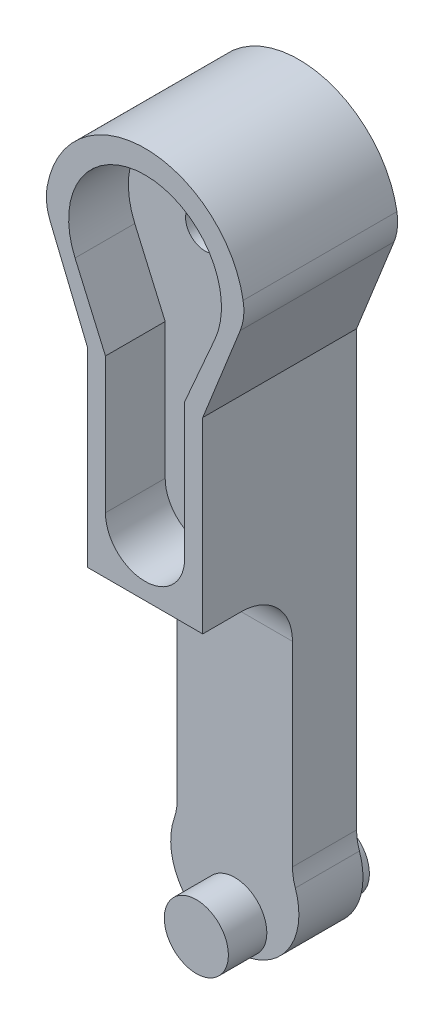
ISO-10303-21;
HEADER;
FILE_DESCRIPTION(('STEP AP214'),'2;1');
FILE_NAME('part.step','',(''),(''),'','','');
FILE_SCHEMA(('AUTOMOTIVE_DESIGN { 1 0 10303 214 1 1 1 1 }'));
ENDSEC;
DATA;
#1=APPLICATION_CONTEXT('core data for automotive mechanical design processes');
#2=APPLICATION_PROTOCOL_DEFINITION('international standard','automotive_design',2000,#1);
#3=PRODUCT_CONTEXT('',#1,'mechanical');
#4=PRODUCT('Part','Part','',(#3));
#5=PRODUCT_RELATED_PRODUCT_CATEGORY('part','',(#4));
#6=PRODUCT_DEFINITION_FORMATION('','',#4);
#7=PRODUCT_DEFINITION_CONTEXT('part definition',#1,'design');
#8=PRODUCT_DEFINITION('design','',#6,#7);
#9=PRODUCT_DEFINITION_SHAPE('','',#8);
#10=(LENGTH_UNIT() NAMED_UNIT(*) SI_UNIT(.MILLI.,.METRE.));
#11=(NAMED_UNIT(*) PLANE_ANGLE_UNIT() SI_UNIT($,.RADIAN.));
#12=(NAMED_UNIT(*) SI_UNIT($,.STERADIAN.) SOLID_ANGLE_UNIT());
#13=UNCERTAINTY_MEASURE_WITH_UNIT(LENGTH_MEASURE(1.E-05),#10,'distance_accuracy_value','');
#14=(GEOMETRIC_REPRESENTATION_CONTEXT(3) GLOBAL_UNCERTAINTY_ASSIGNED_CONTEXT((#13)) GLOBAL_UNIT_ASSIGNED_CONTEXT((#10,
#11,#12)) REPRESENTATION_CONTEXT('',''));
#15=CARTESIAN_POINT('',(0.,0.,0.));
#16=DIRECTION('',(0.,0.,1.));
#17=DIRECTION('',(1.,0.,0.));
#18=AXIS2_PLACEMENT_3D('',#15,#16,#17);
#19=CARTESIAN_POINT('',(4.7070449392675,0.803904832499603,15.24));
#20=DIRECTION('',(0.,0.,-1.));
#21=DIRECTION('',(-1.,0.,0.));
#22=AXIS2_PLACEMENT_3D('',#19,#20,#21);
#23=CYLINDRICAL_SURFACE('',#22,5.08);
#24=DIRECTION('',(0.,0.,-1.));
#25=VECTOR('',#24,1.);
#26=CARTESIAN_POINT('',(9.71453955550952,1.65912273941407,15.24));
#27=LINE('',#26,#25);
#28=CARTESIAN_POINT('',(9.71453955550952,1.65912273941407,15.24));
#29=VERTEX_POINT('',#28);
#30=CARTESIAN_POINT('',(9.71453955550952,1.65912273941407,0.));
#31=VERTEX_POINT('',#30);
#32=EDGE_CURVE('E338',#29,#31,#27,.T.);
#33=ORIENTED_EDGE('',*,*,#32,.F.);
#34=CARTESIAN_POINT('',(4.7070449392675,0.803904832499603,15.24));
#35=DIRECTION('',(0.,0.,1.));
#36=DIRECTION('',(1.,0.,0.));
#37=AXIS2_PLACEMENT_3D('',#34,#35,#36);
#38=CIRCLE('',#37,5.08);
#39=CARTESIAN_POINT('',(9.42612975908371,-1.07669040927366,15.24));
#40=VERTEX_POINT('',#39);
#41=EDGE_CURVE('E52',#40,#29,#38,.T.);
#42=ORIENTED_EDGE('',*,*,#41,.F.);
#43=DIRECTION('',(0.,0.,-1.));
#44=VECTOR('',#43,1.);
#45=CARTESIAN_POINT('',(9.42612975908371,-1.07669040927366,15.24));
#46=LINE('',#45,#44);
#47=CARTESIAN_POINT('',(9.42612975908371,-1.07669040927367,0.));
#48=VERTEX_POINT('',#47);
#49=EDGE_CURVE('E341',#48,#40,#46,.F.);
#50=ORIENTED_EDGE('',*,*,#49,.F.);
#51=CARTESIAN_POINT('',(4.7070449392675,0.803904832499603,0.));
#52=DIRECTION('',(0.,0.,1.));
#53=DIRECTION('',(1.,0.,0.));
#54=AXIS2_PLACEMENT_3D('',#51,#52,#53);
#55=CIRCLE('',#54,5.08);
#56=EDGE_CURVE('E12',#31,#48,#55,.F.);
#57=ORIENTED_EDGE('',*,*,#56,.F.);
#58=EDGE_LOOP('',(#33,#42,#50,#57));
#59=FACE_BOUND('',#58,.T.);
#60=ADVANCED_FACE('F45',(#59),#23,.T.);
#61=CARTESIAN_POINT('',(-4.70262537504735,0.829367000766739,15.24));
#62=DIRECTION('',(0.,0.,-1.));
#63=DIRECTION('',(-1.,0.,0.));
#64=AXIS2_PLACEMENT_3D('',#61,#62,#63);
#65=CYLINDRICAL_SURFACE('',#64,5.08);
#66=DIRECTION('',(0.,0.,-1.));
#67=VECTOR('',#66,1.);
#68=CARTESIAN_POINT('',(-9.70541832722537,1.71167232073136,15.24));
#69=LINE('',#68,#67);
#70=CARTESIAN_POINT('',(-9.70541832722537,1.71167232073135,0.));
#71=VERTEX_POINT('',#70);
#72=CARTESIAN_POINT('',(-9.70541832722537,1.71167232073136,15.24));
#73=VERTEX_POINT('',#72);
#74=EDGE_CURVE('E328',#71,#73,#69,.F.);
#75=ORIENTED_EDGE('',*,*,#74,.F.);
#76=CARTESIAN_POINT('',(-4.70262537504735,0.829367000766739,0.));
#77=DIRECTION('',(0.,0.,1.));
#78=DIRECTION('',(1.,0.,0.));
#79=AXIS2_PLACEMENT_3D('',#76,#77,#78);
#80=CIRCLE('',#79,5.08);
#81=CARTESIAN_POINT('',(-9.39957868221615,-1.10584090286429,0.));
#82=VERTEX_POINT('',#81);
#83=EDGE_CURVE('E334',#82,#71,#80,.F.);
#84=ORIENTED_EDGE('',*,*,#83,.F.);
#85=DIRECTION('',(0.,0.,-1.));
#86=VECTOR('',#85,1.);
#87=CARTESIAN_POINT('',(-9.39957868221615,-1.10584090286429,15.24));
#88=LINE('',#87,#86);
#89=CARTESIAN_POINT('',(-9.39957868221615,-1.10584090286429,15.24));
#90=VERTEX_POINT('',#89);
#91=EDGE_CURVE('E331',#90,#82,#88,.T.);
#92=ORIENTED_EDGE('',*,*,#91,.F.);
#93=CARTESIAN_POINT('',(-4.70262537504735,0.829367000766739,15.24));
#94=DIRECTION('',(0.,0.,1.));
#95=DIRECTION('',(1.,0.,0.));
#96=AXIS2_PLACEMENT_3D('',#93,#94,#95);
#97=CIRCLE('',#96,5.08);
#98=EDGE_CURVE('E336',#73,#90,#97,.T.);
#99=ORIENTED_EDGE('',*,*,#98,.F.);
#100=EDGE_LOOP('',(#75,#84,#92,#99));
#101=FACE_BOUND('',#100,.T.);
#102=ADVANCED_FACE('F353',(#101),#65,.T.);
#103=CARTESIAN_POINT('',(10.795,-53.3932893377318,6.35));
#104=DIRECTION('',(0.,0.,-1.));
#105=DIRECTION('',(-1.,0.,0.));
#106=AXIS2_PLACEMENT_3D('',#103,#104,#105);
#107=CYLINDRICAL_SURFACE('',#106,5.08);
#108=DIRECTION('',(0.,0.,1.));
#109=VECTOR('',#108,1.);
#110=CARTESIAN_POINT('',(5.715,-53.3932893377318,6.35));
#111=LINE('',#110,#109);
#112=CARTESIAN_POINT('',(5.715,-53.3932893377317,6.35));
#113=VERTEX_POINT('',#112);
#114=CARTESIAN_POINT('',(5.715,-53.3932893377317,0.));
#115=VERTEX_POINT('',#114);
#116=EDGE_CURVE('E318',#113,#115,#111,.F.);
#117=ORIENTED_EDGE('',*,*,#116,.F.);
#118=CARTESIAN_POINT('',(10.795,-53.3932893377318,6.35));
#119=DIRECTION('',(0.,0.,1.));
#120=DIRECTION('',(1.,0.,0.));
#121=AXIS2_PLACEMENT_3D('',#118,#119,#120);
#122=CIRCLE('',#121,5.08);
#123=CARTESIAN_POINT('',(5.99722222222223,-55.0629385209621,6.35));
#124=VERTEX_POINT('',#123);
#125=EDGE_CURVE('E324',#113,#124,#122,.T.);
#126=ORIENTED_EDGE('',*,*,#125,.T.);
#127=DIRECTION('',(0.,0.,-1.));
#128=VECTOR('',#127,1.);
#129=CARTESIAN_POINT('',(5.99722222222222,-55.0629385209621,6.35));
#130=LINE('',#129,#128);
#131=CARTESIAN_POINT('',(5.99722222222223,-55.0629385209621,0.));
#132=VERTEX_POINT('',#131);
#133=EDGE_CURVE('E321',#132,#124,#130,.F.);
#134=ORIENTED_EDGE('',*,*,#133,.F.);
#135=CARTESIAN_POINT('',(10.795,-53.3932893377318,0.));
#136=DIRECTION('',(0.,0.,1.));
#137=DIRECTION('',(1.,0.,0.));
#138=AXIS2_PLACEMENT_3D('',#135,#136,#137);
#139=CIRCLE('',#138,5.08);
#140=EDGE_CURVE('E326',#132,#115,#139,.F.);
#141=ORIENTED_EDGE('',*,*,#140,.T.);
#142=EDGE_LOOP('',(#117,#126,#134,#141));
#143=FACE_BOUND('',#142,.T.);
#144=ADVANCED_FACE('F387',(#143),#107,.F.);
#145=CARTESIAN_POINT('',(-10.795,-53.3932893377318,6.35));
#146=DIRECTION('',(0.,0.,-1.));
#147=DIRECTION('',(-1.,0.,0.));
#148=AXIS2_PLACEMENT_3D('',#145,#146,#147);
#149=CYLINDRICAL_SURFACE('',#148,5.08);
#150=DIRECTION('',(0.,0.,1.));
#151=VECTOR('',#150,1.);
#152=CARTESIAN_POINT('',(-5.715,-53.3932893377318,6.35));
#153=LINE('',#152,#151);
#154=CARTESIAN_POINT('',(-5.715,-53.3932893377318,0.));
#155=VERTEX_POINT('',#154);
#156=CARTESIAN_POINT('',(-5.715,-53.3932893377321,6.35));
#157=VERTEX_POINT('',#156);
#158=EDGE_CURVE('E308',#155,#157,#153,.T.);
#159=ORIENTED_EDGE('',*,*,#158,.F.);
#160=CARTESIAN_POINT('',(-10.795,-53.3932893377318,0.));
#161=DIRECTION('',(0.,0.,1.));
#162=DIRECTION('',(1.,0.,0.));
#163=AXIS2_PLACEMENT_3D('',#160,#161,#162);
#164=CIRCLE('',#163,5.08);
#165=CARTESIAN_POINT('',(-5.9972222222225,-55.0629385209629,0.));
#166=VERTEX_POINT('',#165);
#167=EDGE_CURVE('E314',#155,#166,#164,.F.);
#168=ORIENTED_EDGE('',*,*,#167,.T.);
#169=DIRECTION('',(0.,0.,-1.));
#170=VECTOR('',#169,1.);
#171=CARTESIAN_POINT('',(-5.99722222222222,-55.0629385209621,6.35));
#172=LINE('',#171,#170);
#173=CARTESIAN_POINT('',(-5.9972222222225,-55.0629385209629,6.35));
#174=VERTEX_POINT('',#173);
#175=EDGE_CURVE('E311',#174,#166,#172,.T.);
#176=ORIENTED_EDGE('',*,*,#175,.F.);
#177=CARTESIAN_POINT('',(-10.795,-53.3932893377318,6.35));
#178=DIRECTION('',(0.,0.,1.));
#179=DIRECTION('',(1.,0.,0.));
#180=AXIS2_PLACEMENT_3D('',#177,#178,#179);
#181=CIRCLE('',#180,5.08);
#182=EDGE_CURVE('E316',#174,#157,#181,.T.);
#183=ORIENTED_EDGE('',*,*,#182,.T.);
#184=EDGE_LOOP('',(#159,#168,#176,#183));
#185=FACE_BOUND('',#184,.T.);
#186=ADVANCED_FACE('F419',(#185),#149,.F.);
#187=CARTESIAN_POINT('',(-5.715,0.,6.35));
#188=DIRECTION('',(1.,0.,0.));
#189=DIRECTION('',(0.,1.,0.));
#190=AXIS2_PLACEMENT_3D('',#187,#188,#189);
#191=PLANE('',#190);
#192=DIRECTION('',(0.,-1.,0.));
#193=VECTOR('',#192,1.);
#194=CARTESIAN_POINT('',(-5.715,0.,0.));
#195=LINE('',#194,#193);
#196=CARTESIAN_POINT('',(-5.715,-10.048701251092,0.));
#197=VERTEX_POINT('',#196);
#198=EDGE_CURVE('E282',#197,#155,#195,.T.);
#199=ORIENTED_EDGE('',*,*,#198,.T.);
#200=ORIENTED_EDGE('',*,*,#158,.T.);
#201=DIRECTION('',(0.,-1.,0.));
#202=VECTOR('',#201,1.);
#203=CARTESIAN_POINT('',(-5.715,0.,6.35));
#204=LINE('',#203,#202);
#205=CARTESIAN_POINT('',(-5.715,-34.036,6.35));
#206=VERTEX_POINT('',#205);
#207=EDGE_CURVE('E283',#206,#157,#204,.T.);
#208=ORIENTED_EDGE('',*,*,#207,.F.);
#209=CARTESIAN_POINT('',(-5.715,-34.036,11.43));
#210=DIRECTION('',(1.,0.,0.));
#211=DIRECTION('',(0.,1.,0.));
#212=AXIS2_PLACEMENT_3D('',#209,#210,#211);
#213=CIRCLE('',#212,5.08);
#214=CARTESIAN_POINT('',(-5.715,-28.956,11.43));
#215=VERTEX_POINT('',#214);
#216=EDGE_CURVE('E306',#206,#215,#213,.T.);
#217=ORIENTED_EDGE('',*,*,#216,.T.);
#218=DIRECTION('',(0.,0.,-1.));
#219=VECTOR('',#218,1.);
#220=CARTESIAN_POINT('',(-5.715,-28.956,15.24));
#221=LINE('',#220,#219);
#222=CARTESIAN_POINT('',(-5.715,-28.956,15.24));
#223=VERTEX_POINT('',#222);
#224=EDGE_CURVE('E262',#223,#215,#221,.T.);
#225=ORIENTED_EDGE('',*,*,#224,.F.);
#226=DIRECTION('',(0.,-1.,0.));
#227=VECTOR('',#226,1.);
#228=CARTESIAN_POINT('',(-5.715,-28.956,15.24));
#229=LINE('',#228,#227);
#230=CARTESIAN_POINT('',(-5.715,-10.048701251092,15.24));
#231=VERTEX_POINT('',#230);
#232=EDGE_CURVE('E247',#231,#223,#229,.T.);
#233=ORIENTED_EDGE('',*,*,#232,.F.);
#234=DIRECTION('',(0.,0.,-1.));
#235=VECTOR('',#234,1.);
#236=CARTESIAN_POINT('',(-5.715,-10.048701251092,15.24));
#237=LINE('',#236,#235);
#238=EDGE_CURVE('E265',#231,#197,#237,.T.);
#239=ORIENTED_EDGE('',*,*,#238,.T.);
#240=EDGE_LOOP('',(#199,#200,#208,#217,#225,#233,#239));
#241=FACE_BOUND('',#240,.T.);
#242=ADVANCED_FACE('F364',(#241),#191,.F.);
#243=CARTESIAN_POINT('',(0.,0.,6.35));
#244=DIRECTION('',(0.,0.,1.));
#245=DIRECTION('',(1.,0.,0.));
#246=AXIS2_PLACEMENT_3D('',#243,#244,#245);
#247=PLANE('',#246);
#248=ORIENTED_EDGE('',*,*,#125,.F.);
#249=DIRECTION('',(0.,1.,0.));
#250=VECTOR('',#249,1.);
#251=CARTESIAN_POINT('',(5.715,0.,6.35));
#252=LINE('',#251,#250);
#253=CARTESIAN_POINT('',(5.715,-34.036,6.35));
#254=VERTEX_POINT('',#253);
#255=EDGE_CURVE('E290',#113,#254,#252,.T.);
#256=ORIENTED_EDGE('',*,*,#255,.T.);
#257=DIRECTION('',(1.,0.,0.));
#258=VECTOR('',#257,1.);
#259=CARTESIAN_POINT('',(0.,-34.036,6.35));
#260=LINE('',#259,#258);
#261=EDGE_CURVE('E301',#254,#206,#260,.F.);
#262=ORIENTED_EDGE('',*,*,#261,.T.);
#263=ORIENTED_EDGE('',*,*,#207,.T.);
#264=ORIENTED_EDGE('',*,*,#182,.F.);
#265=CARTESIAN_POINT('',(0.,-57.15,6.35));
#266=DIRECTION('',(0.,0.,1.));
#267=DIRECTION('',(1.,0.,0.));
#268=AXIS2_PLACEMENT_3D('',#265,#266,#267);
#269=CIRCLE('',#268,6.35);
#270=CARTESIAN_POINT('',(0.,-63.5,6.35));
#271=VERTEX_POINT('',#270);
#272=EDGE_CURVE('E288',#174,#271,#269,.T.);
#273=ORIENTED_EDGE('',*,*,#272,.T.);
#274=CARTESIAN_POINT('',(0.,-60.325,6.35));
#275=DIRECTION('',(0.,0.,1.));
#276=DIRECTION('',(1.,0.,0.));
#277=AXIS2_PLACEMENT_3D('',#274,#275,#276);
#278=CIRCLE('',#277,3.17499999999999);
#279=EDGE_CURVE('E271',#271,#271,#278,.T.);
#280=ORIENTED_EDGE('',*,*,#279,.F.);
#281=EDGE_CURVE('E286',#271,#124,#269,.T.);
#282=ORIENTED_EDGE('',*,*,#281,.T.);
#283=EDGE_LOOP('',(#248,#256,#262,#263,#264,#273,#280,#282));
#284=FACE_BOUND('',#283,.T.);
#285=ADVANCED_FACE('F431',(#284),#247,.T.);
#286=CARTESIAN_POINT('',(0.,0.,0.));
#287=DIRECTION('',(0.,0.,1.));
#288=DIRECTION('',(1.,0.,0.));
#289=AXIS2_PLACEMENT_3D('',#286,#287,#288);
#290=PLANE('',#289);
#291=CARTESIAN_POINT('',(0.,0.,0.));
#292=DIRECTION('',(0.,0.,1.));
#293=DIRECTION('',(1.,0.,0.));
#294=AXIS2_PLACEMENT_3D('',#291,#292,#293);
#295=CIRCLE('',#294,9.8552);
#296=EDGE_CURVE('E215',#71,#31,#295,.F.);
#297=ORIENTED_EDGE('',*,*,#296,.T.);
#298=ORIENTED_EDGE('',*,*,#56,.T.);
#299=DIRECTION('',(0.370195913734895,0.928953704688229,0.));
#300=VECTOR('',#299,1.);
#301=CARTESIAN_POINT('',(8.50459397264613,-3.38915267871681,0.));
#302=LINE('',#301,#300);
#303=CARTESIAN_POINT('',(5.715,-10.3892398199307,0.));
#304=VERTEX_POINT('',#303);
#305=EDGE_CURVE('E211',#304,#48,#302,.T.);
#306=ORIENTED_EDGE('',*,*,#305,.F.);
#307=DIRECTION('',(0.,1.,0.));
#308=VECTOR('',#307,1.);
#309=CARTESIAN_POINT('',(5.715,0.,0.));
#310=LINE('',#309,#308);
#311=EDGE_CURVE('E287',#115,#304,#310,.T.);
#312=ORIENTED_EDGE('',*,*,#311,.F.);
#313=ORIENTED_EDGE('',*,*,#140,.F.);
#314=CARTESIAN_POINT('',(0.,-57.15,0.));
#315=DIRECTION('',(0.,0.,1.));
#316=DIRECTION('',(1.,0.,0.));
#317=AXIS2_PLACEMENT_3D('',#314,#315,#316);
#318=CIRCLE('',#317,6.35);
#319=CARTESIAN_POINT('',(0.,-63.5,0.));
#320=VERTEX_POINT('',#319);
#321=EDGE_CURVE('E295',#320,#132,#318,.T.);
#322=ORIENTED_EDGE('',*,*,#321,.F.);
#323=CARTESIAN_POINT('',(0.,-60.325,0.));
#324=DIRECTION('',(0.,0.,1.));
#325=DIRECTION('',(1.,0.,0.));
#326=AXIS2_PLACEMENT_3D('',#323,#324,#325);
#327=CIRCLE('',#326,3.17499999999999);
#328=EDGE_CURVE('E267',#320,#320,#327,.T.);
#329=ORIENTED_EDGE('',*,*,#328,.T.);
#330=EDGE_CURVE('E296',#166,#320,#318,.T.);
#331=ORIENTED_EDGE('',*,*,#330,.F.);
#332=ORIENTED_EDGE('',*,*,#167,.F.);
#333=ORIENTED_EDGE('',*,*,#198,.F.);
#334=DIRECTION('',(-0.380946437722644,0.924597107710395,0.));
#335=VECTOR('',#334,1.);
#336=CARTESIAN_POINT('',(-8.42501151914656,-3.47121800320017,0.));
#337=LINE('',#336,#335);
#338=EDGE_CURVE('E217',#197,#82,#337,.T.);
#339=ORIENTED_EDGE('',*,*,#338,.T.);
#340=ORIENTED_EDGE('',*,*,#83,.T.);
#341=EDGE_LOOP('',(#297,#298,#306,#312,#313,#322,#329,#331,#332,#333,#339,#340));
#342=FACE_BOUND('',#341,.T.);
#343=CARTESIAN_POINT('',(0.,0.,0.));
#344=DIRECTION('',(0.,0.,1.));
#345=DIRECTION('',(1.,0.,0.));
#346=AXIS2_PLACEMENT_3D('',#343,#344,#345);
#347=CIRCLE('',#346,1.905);
#348=CARTESIAN_POINT('',(1.905,0.,0.));
#349=VERTEX_POINT('',#348);
#350=EDGE_CURVE('E277',#349,#349,#347,.T.);
#351=ORIENTED_EDGE('',*,*,#350,.T.);
#352=EDGE_LOOP('',(#351));
#353=FACE_BOUND('',#352,.T.);
#354=ADVANCED_FACE('F380',(#342,#353),#290,.F.);
#355=CARTESIAN_POINT('',(0.,-57.15,6.35));
#356=DIRECTION('',(0.,0.,-1.));
#357=DIRECTION('',(-1.,0.,0.));
#358=AXIS2_PLACEMENT_3D('',#355,#356,#357);
#359=CYLINDRICAL_SURFACE('',#358,6.35);
#360=ORIENTED_EDGE('',*,*,#321,.T.);
#361=ORIENTED_EDGE('',*,*,#133,.T.);
#362=ORIENTED_EDGE('',*,*,#281,.F.);
#363=ORIENTED_EDGE('',*,*,#272,.F.);
#364=ORIENTED_EDGE('',*,*,#175,.T.);
#365=ORIENTED_EDGE('',*,*,#330,.T.);
#366=EDGE_LOOP('',(#360,#361,#362,#363,#364,#365));
#367=FACE_BOUND('',#366,.T.);
#368=ADVANCED_FACE('F391',(#367),#359,.T.);
#369=CARTESIAN_POINT('',(5.715,0.,6.35));
#370=DIRECTION('',(-1.,0.,0.));
#371=DIRECTION('',(0.,-1.,0.));
#372=AXIS2_PLACEMENT_3D('',#369,#370,#371);
#373=PLANE('',#372);
#374=ORIENTED_EDGE('',*,*,#255,.F.);
#375=ORIENTED_EDGE('',*,*,#116,.T.);
#376=ORIENTED_EDGE('',*,*,#311,.T.);
#377=DIRECTION('',(0.,0.,-1.));
#378=VECTOR('',#377,1.);
#379=CARTESIAN_POINT('',(5.715,-10.3892398199307,15.24));
#380=LINE('',#379,#378);
#381=CARTESIAN_POINT('',(5.715,-10.3892398199307,15.24));
#382=VERTEX_POINT('',#381);
#383=EDGE_CURVE('E256',#382,#304,#380,.T.);
#384=ORIENTED_EDGE('',*,*,#383,.F.);
#385=DIRECTION('',(0.,1.,0.));
#386=VECTOR('',#385,1.);
#387=CARTESIAN_POINT('',(5.715,-10.3892398199307,15.24));
#388=LINE('',#387,#386);
#389=CARTESIAN_POINT('',(5.715,-28.956,15.24));
#390=VERTEX_POINT('',#389);
#391=EDGE_CURVE('E251',#390,#382,#388,.T.);
#392=ORIENTED_EDGE('',*,*,#391,.F.);
#393=DIRECTION('',(0.,0.,-1.));
#394=VECTOR('',#393,1.);
#395=CARTESIAN_POINT('',(5.715,-28.956,15.24));
#396=LINE('',#395,#394);
#397=CARTESIAN_POINT('',(5.715,-28.956,11.43));
#398=VERTEX_POINT('',#397);
#399=EDGE_CURVE('E259',#390,#398,#396,.T.);
#400=ORIENTED_EDGE('',*,*,#399,.T.);
#401=CARTESIAN_POINT('',(5.715,-34.036,11.43));
#402=DIRECTION('',(-1.,0.,0.));
#403=DIRECTION('',(0.,-1.,0.));
#404=AXIS2_PLACEMENT_3D('',#401,#402,#403);
#405=CIRCLE('',#404,5.08);
#406=EDGE_CURVE('E303',#398,#254,#405,.T.);
#407=ORIENTED_EDGE('',*,*,#406,.T.);
#408=EDGE_LOOP('',(#374,#375,#376,#384,#392,#400,#407));
#409=FACE_BOUND('',#408,.T.);
#410=ADVANCED_FACE('F376',(#409),#373,.F.);
#411=CARTESIAN_POINT('',(0.,0.,6.35));
#412=DIRECTION('',(0.,0.,-1.));
#413=DIRECTION('',(-1.,0.,0.));
#414=AXIS2_PLACEMENT_3D('',#411,#412,#413);
#415=CYLINDRICAL_SURFACE('',#414,1.905);
#416=ORIENTED_EDGE('',*,*,#350,.F.);
#417=EDGE_LOOP('',(#416));
#418=FACE_BOUND('',#417,.T.);
#419=CARTESIAN_POINT('',(0.,0.,9.3218));
#420=DIRECTION('',(0.,0.,1.));
#421=DIRECTION('',(1.,0.,0.));
#422=AXIS2_PLACEMENT_3D('',#419,#420,#421);
#423=CIRCLE('',#422,1.905);
#424=CARTESIAN_POINT('',(1.905,0.,9.3218));
#425=VERTEX_POINT('',#424);
#426=EDGE_CURVE('E206',#425,#425,#423,.F.);
#427=ORIENTED_EDGE('',*,*,#426,.F.);
#428=EDGE_LOOP('',(#427));
#429=FACE_BOUND('',#428,.T.);
#430=ADVANCED_FACE('F436',(#418,#429),#415,.F.);
#431=CARTESIAN_POINT('',(0.,-60.325,10.16));
#432=DIRECTION('',(0.,0.,-1.));
#433=DIRECTION('',(-1.,0.,0.));
#434=AXIS2_PLACEMENT_3D('',#431,#432,#433);
#435=CYLINDRICAL_SURFACE('',#434,3.17499999999999);
#436=CARTESIAN_POINT('',(0.,-60.325,10.16));
#437=DIRECTION('',(0.,0.,1.));
#438=DIRECTION('',(1.,0.,0.));
#439=AXIS2_PLACEMENT_3D('',#436,#437,#438);
#440=CIRCLE('',#439,3.17499999999999);
#441=CARTESIAN_POINT('',(3.17499999999999,-60.325,10.16));
#442=VERTEX_POINT('',#441);
#443=EDGE_CURVE('E274',#442,#442,#440,.T.);
#444=ORIENTED_EDGE('',*,*,#443,.F.);
#445=EDGE_LOOP('',(#444));
#446=FACE_BOUND('',#445,.T.);
#447=ORIENTED_EDGE('',*,*,#279,.T.);
#448=EDGE_LOOP('',(#447));
#449=FACE_BOUND('',#448,.T.);
#450=ADVANCED_FACE('F409',(#446,#449),#435,.T.);
#451=CARTESIAN_POINT('',(0.,-60.325,10.16));
#452=DIRECTION('',(0.,0.,1.));
#453=DIRECTION('',(1.,0.,0.));
#454=AXIS2_PLACEMENT_3D('',#451,#452,#453);
#455=PLANE('',#454);
#456=ORIENTED_EDGE('',*,*,#443,.T.);
#457=EDGE_LOOP('',(#456));
#458=FACE_BOUND('',#457,.T.);
#459=ADVANCED_FACE('F400',(#458),#455,.T.);
#460=CARTESIAN_POINT('',(0.,-60.325,-3.81));
#461=DIRECTION('',(0.,0.,1.));
#462=DIRECTION('',(1.,0.,0.));
#463=AXIS2_PLACEMENT_3D('',#460,#461,#462);
#464=CYLINDRICAL_SURFACE('',#463,3.17499999999999);
#465=CARTESIAN_POINT('',(0.,-60.325,-3.81));
#466=DIRECTION('',(0.,0.,1.));
#467=DIRECTION('',(1.,0.,0.));
#468=AXIS2_PLACEMENT_3D('',#465,#466,#467);
#469=CIRCLE('',#468,3.17499999999999);
#470=CARTESIAN_POINT('',(3.17499999999999,-60.325,-3.81));
#471=VERTEX_POINT('',#470);
#472=EDGE_CURVE('E268',#471,#471,#469,.T.);
#473=ORIENTED_EDGE('',*,*,#472,.T.);
#474=EDGE_LOOP('',(#473));
#475=FACE_BOUND('',#474,.T.);
#476=ORIENTED_EDGE('',*,*,#328,.F.);
#477=EDGE_LOOP('',(#476));
#478=FACE_BOUND('',#477,.T.);
#479=ADVANCED_FACE('F397',(#475,#478),#464,.T.);
#480=CARTESIAN_POINT('',(0.,-60.325,-3.81));
#481=DIRECTION('',(0.,0.,1.));
#482=DIRECTION('',(1.,0.,0.));
#483=AXIS2_PLACEMENT_3D('',#480,#481,#482);
#484=PLANE('',#483);
#485=ORIENTED_EDGE('',*,*,#472,.F.);
#486=EDGE_LOOP('',(#485));
#487=FACE_BOUND('',#486,.T.);
#488=ADVANCED_FACE('F399',(#487),#484,.F.);
#489=CARTESIAN_POINT('',(0.,0.,15.24));
#490=DIRECTION('',(0.,0.,1.));
#491=DIRECTION('',(1.,0.,0.));
#492=AXIS2_PLACEMENT_3D('',#489,#490,#491);
#493=PLANE('',#492);
#494=DIRECTION('',(0.370195913734895,0.92895370468823,0.));
#495=VECTOR('',#494,1.);
#496=CARTESIAN_POINT('',(9.8552,0.,15.24));
#497=LINE('',#496,#495);
#498=EDGE_CURVE('E253',#382,#40,#497,.T.);
#499=ORIENTED_EDGE('',*,*,#498,.T.);
#500=ORIENTED_EDGE('',*,*,#41,.T.);
#501=CARTESIAN_POINT('',(0.,0.,15.24));
#502=DIRECTION('',(0.,0.,1.));
#503=DIRECTION('',(1.,0.,0.));
#504=AXIS2_PLACEMENT_3D('',#501,#502,#503);
#505=CIRCLE('',#504,9.8552);
#506=EDGE_CURVE('E243',#29,#73,#505,.T.);
#507=ORIENTED_EDGE('',*,*,#506,.T.);
#508=ORIENTED_EDGE('',*,*,#98,.T.);
#509=DIRECTION('',(0.380946437722644,-0.924597107710395,0.));
#510=VECTOR('',#509,1.);
#511=CARTESIAN_POINT('',(-9.8552,0.,15.24));
#512=LINE('',#511,#510);
#513=EDGE_CURVE('E245',#90,#231,#512,.T.);
#514=ORIENTED_EDGE('',*,*,#513,.T.);
#515=ORIENTED_EDGE('',*,*,#232,.T.);
#516=DIRECTION('',(1.,0.,0.));
#517=VECTOR('',#516,1.);
#518=CARTESIAN_POINT('',(5.715,-28.956,15.24));
#519=LINE('',#518,#517);
#520=EDGE_CURVE('E249',#223,#390,#519,.T.);
#521=ORIENTED_EDGE('',*,*,#520,.T.);
#522=ORIENTED_EDGE('',*,*,#391,.T.);
#523=EDGE_LOOP('',(#499,#500,#507,#508,#514,#515,#521,#522));
#524=FACE_BOUND('',#523,.T.);
#525=DIRECTION('',(0.,1.,0.));
#526=VECTOR('',#525,1.);
#527=CARTESIAN_POINT('',(3.9243,-23.3807,15.24));
#528=LINE('',#527,#526);
#529=CARTESIAN_POINT('',(3.9243,-23.3807,15.24));
#530=VERTEX_POINT('',#529);
#531=CARTESIAN_POINT('',(3.9243,-9.92891356110066,15.24));
#532=VERTEX_POINT('',#531);
#533=EDGE_CURVE('E222',#530,#532,#528,.T.);
#534=ORIENTED_EDGE('',*,*,#533,.F.);
#535=CARTESIAN_POINT('',(0.,-23.3807,15.24));
#536=DIRECTION('',(0.,0.,1.));
#537=DIRECTION('',(1.,0.,0.));
#538=AXIS2_PLACEMENT_3D('',#535,#536,#537);
#539=CIRCLE('',#538,3.9243);
#540=CARTESIAN_POINT('',(-3.9243,-23.3807,15.24));
#541=VERTEX_POINT('',#540);
#542=EDGE_CURVE('E220',#541,#530,#539,.T.);
#543=ORIENTED_EDGE('',*,*,#542,.F.);
#544=DIRECTION('',(0.,-1.,0.));
#545=VECTOR('',#544,1.);
#546=CARTESIAN_POINT('',(-3.9243,-23.3807,15.24));
#547=LINE('',#546,#545);
#548=CARTESIAN_POINT('',(-3.9243,-9.92891356110066,15.24));
#549=VERTEX_POINT('',#548);
#550=EDGE_CURVE('E185',#549,#541,#547,.T.);
#551=ORIENTED_EDGE('',*,*,#550,.F.);
#552=DIRECTION('',(0.400116142376727,-0.916464441541278,0.));
#553=VECTOR('',#552,1.);
#554=CARTESIAN_POINT('',(-3.9243,-9.92891356110066,15.24));
#555=LINE('',#554,#553);
#556=CARTESIAN_POINT('',(-6.93690265091425,-3.02855910487792,15.24));
#557=VERTEX_POINT('',#556);
#558=EDGE_CURVE('E228',#557,#549,#555,.T.);
#559=ORIENTED_EDGE('',*,*,#558,.F.);
#560=CARTESIAN_POINT('',(0.,0.,15.24));
#561=DIRECTION('',(0.,0.,1.));
#562=DIRECTION('',(1.,0.,0.));
#563=AXIS2_PLACEMENT_3D('',#560,#561,#562);
#564=CIRCLE('',#563,7.5692);
#565=CARTESIAN_POINT('',(6.93690265091425,-3.02855910487792,15.24));
#566=VERTEX_POINT('',#565);
#567=EDGE_CURVE('E226',#566,#557,#564,.T.);
#568=ORIENTED_EDGE('',*,*,#567,.F.);
#569=DIRECTION('',(0.400116142376726,0.916464441541278,0.));
#570=VECTOR('',#569,1.);
#571=CARTESIAN_POINT('',(3.9243,-9.92891356110066,15.24));
#572=LINE('',#571,#570);
#573=EDGE_CURVE('E224',#532,#566,#572,.T.);
#574=ORIENTED_EDGE('',*,*,#573,.F.);
#575=EDGE_LOOP('',(#534,#543,#551,#559,#568,#574));
#576=FACE_BOUND('',#575,.T.);
#577=ADVANCED_FACE('F343',(#524,#576),#493,.T.);
#578=CARTESIAN_POINT('',(0.,0.,15.24));
#579=DIRECTION('',(0.,0.,-1.));
#580=DIRECTION('',(-1.,0.,0.));
#581=AXIS2_PLACEMENT_3D('',#578,#579,#580);
#582=CYLINDRICAL_SURFACE('',#581,9.8552);
#583=ORIENTED_EDGE('',*,*,#506,.F.);
#584=ORIENTED_EDGE('',*,*,#32,.T.);
#585=ORIENTED_EDGE('',*,*,#296,.F.);
#586=ORIENTED_EDGE('',*,*,#74,.T.);
#587=EDGE_LOOP('',(#583,#584,#585,#586));
#588=FACE_BOUND('',#587,.T.);
#589=ADVANCED_FACE('F350',(#588),#582,.T.);
#590=CARTESIAN_POINT('',(-9.8552,0.,15.24));
#591=DIRECTION('',(0.924597107710395,0.380946437722644,0.));
#592=DIRECTION('',(-0.380946437722644,0.924597107710395,0.));
#593=AXIS2_PLACEMENT_3D('',#590,#591,#592);
#594=PLANE('',#593);
#595=ORIENTED_EDGE('',*,*,#513,.F.);
#596=ORIENTED_EDGE('',*,*,#91,.T.);
#597=ORIENTED_EDGE('',*,*,#338,.F.);
#598=ORIENTED_EDGE('',*,*,#238,.F.);
#599=EDGE_LOOP('',(#595,#596,#597,#598));
#600=FACE_BOUND('',#599,.T.);
#601=ADVANCED_FACE('F361',(#600),#594,.F.);
#602=CARTESIAN_POINT('',(5.715,-28.956,15.24));
#603=DIRECTION('',(0.,1.,0.));
#604=DIRECTION('',(0.,0.,1.));
#605=AXIS2_PLACEMENT_3D('',#602,#603,#604);
#606=PLANE('',#605);
#607=ORIENTED_EDGE('',*,*,#224,.T.);
#608=DIRECTION('',(1.,0.,0.));
#609=VECTOR('',#608,1.);
#610=CARTESIAN_POINT('',(5.715,-28.956,11.43));
#611=LINE('',#610,#609);
#612=EDGE_CURVE('E292',#215,#398,#611,.T.);
#613=ORIENTED_EDGE('',*,*,#612,.T.);
#614=ORIENTED_EDGE('',*,*,#399,.F.);
#615=ORIENTED_EDGE('',*,*,#520,.F.);
#616=EDGE_LOOP('',(#607,#613,#614,#615));
#617=FACE_BOUND('',#616,.T.);
#618=ADVANCED_FACE('F371',(#617),#606,.F.);
#619=CARTESIAN_POINT('',(9.8552,0.,15.24));
#620=DIRECTION('',(-0.928953704688229,0.370195913734895,0.));
#621=DIRECTION('',(-0.370195913734895,-0.928953704688229,0.));
#622=AXIS2_PLACEMENT_3D('',#619,#620,#621);
#623=PLANE('',#622);
#624=ORIENTED_EDGE('',*,*,#305,.T.);
#625=ORIENTED_EDGE('',*,*,#49,.T.);
#626=ORIENTED_EDGE('',*,*,#498,.F.);
#627=ORIENTED_EDGE('',*,*,#383,.T.);
#628=EDGE_LOOP('',(#624,#625,#626,#627));
#629=FACE_BOUND('',#628,.T.);
#630=ADVANCED_FACE('F379',(#629),#623,.F.);
#631=CARTESIAN_POINT('',(0.,-23.3807,15.24));
#632=DIRECTION('',(0.,0.,-1.));
#633=DIRECTION('',(-1.,0.,0.));
#634=AXIS2_PLACEMENT_3D('',#631,#632,#633);
#635=CYLINDRICAL_SURFACE('',#634,3.9243);
#636=CARTESIAN_POINT('',(0.,-23.3807,9.3218));
#637=DIRECTION('',(0.,0.,1.));
#638=DIRECTION('',(1.,0.,0.));
#639=AXIS2_PLACEMENT_3D('',#636,#637,#638);
#640=CIRCLE('',#639,3.9243);
#641=CARTESIAN_POINT('',(-3.9243,-23.3807,9.3218));
#642=VERTEX_POINT('',#641);
#643=CARTESIAN_POINT('',(3.9243,-23.3807,9.3218));
#644=VERTEX_POINT('',#643);
#645=EDGE_CURVE('E192',#642,#644,#640,.T.);
#646=ORIENTED_EDGE('',*,*,#645,.F.);
#647=DIRECTION('',(0.,0.,-1.));
#648=VECTOR('',#647,1.);
#649=CARTESIAN_POINT('',(-3.9243,-23.3807,15.24));
#650=LINE('',#649,#648);
#651=EDGE_CURVE('E178',#541,#642,#650,.T.);
#652=ORIENTED_EDGE('',*,*,#651,.F.);
#653=ORIENTED_EDGE('',*,*,#542,.T.);
#654=DIRECTION('',(0.,0.,-1.));
#655=VECTOR('',#654,1.);
#656=CARTESIAN_POINT('',(3.9243,-23.3807,15.24));
#657=LINE('',#656,#655);
#658=EDGE_CURVE('E195',#530,#644,#657,.T.);
#659=ORIENTED_EDGE('',*,*,#658,.T.);
#660=EDGE_LOOP('',(#646,#652,#653,#659));
#661=FACE_BOUND('',#660,.T.);
#662=ADVANCED_FACE('F193',(#661),#635,.F.);
#663=CARTESIAN_POINT('',(3.9243,-23.3807,15.24));
#664=DIRECTION('',(-1.,0.,0.));
#665=DIRECTION('',(0.,0.,1.));
#666=AXIS2_PLACEMENT_3D('',#663,#664,#665);
#667=PLANE('',#666);
#668=DIRECTION('',(0.,1.,0.));
#669=VECTOR('',#668,1.);
#670=CARTESIAN_POINT('',(3.9243,0.,9.3218));
#671=LINE('',#670,#669);
#672=CARTESIAN_POINT('',(3.9243,-9.92891356110066,9.3218));
#673=VERTEX_POINT('',#672);
#674=EDGE_CURVE('E198',#644,#673,#671,.T.);
#675=ORIENTED_EDGE('',*,*,#674,.F.);
#676=ORIENTED_EDGE('',*,*,#658,.F.);
#677=ORIENTED_EDGE('',*,*,#533,.T.);
#678=DIRECTION('',(0.,0.,-1.));
#679=VECTOR('',#678,1.);
#680=CARTESIAN_POINT('',(3.9243,-9.92891356110066,15.24));
#681=LINE('',#680,#679);
#682=EDGE_CURVE('E239',#532,#673,#681,.T.);
#683=ORIENTED_EDGE('',*,*,#682,.T.);
#684=EDGE_LOOP('',(#675,#676,#677,#683));
#685=FACE_BOUND('',#684,.T.);
#686=ADVANCED_FACE('F491',(#685),#667,.T.);
#687=CARTESIAN_POINT('',(3.9243,-9.92891356110066,15.24));
#688=DIRECTION('',(-0.916464441541278,0.400116142376726,0.));
#689=DIRECTION('',(-0.400116142376726,-0.916464441541279,0.));
#690=AXIS2_PLACEMENT_3D('',#687,#688,#689);
#691=PLANE('',#690);
#692=DIRECTION('',(0.400116142376726,0.916464441541279,0.));
#693=VECTOR('',#692,1.);
#694=CARTESIAN_POINT('',(6.93690265091425,-3.02855910487792,9.3218));
#695=LINE('',#694,#693);
#696=CARTESIAN_POINT('',(6.93690265091425,-3.02855910487792,9.3218));
#697=VERTEX_POINT('',#696);
#698=EDGE_CURVE('E721',#673,#697,#695,.T.);
#699=ORIENTED_EDGE('',*,*,#698,.F.);
#700=ORIENTED_EDGE('',*,*,#682,.F.);
#701=ORIENTED_EDGE('',*,*,#573,.T.);
#702=DIRECTION('',(0.,0.,-1.));
#703=VECTOR('',#702,1.);
#704=CARTESIAN_POINT('',(6.93690265091425,-3.02855910487792,15.24));
#705=LINE('',#704,#703);
#706=EDGE_CURVE('E236',#566,#697,#705,.T.);
#707=ORIENTED_EDGE('',*,*,#706,.T.);
#708=EDGE_LOOP('',(#699,#700,#701,#707));
#709=FACE_BOUND('',#708,.T.);
#710=ADVANCED_FACE('F503',(#709),#691,.T.);
#711=CARTESIAN_POINT('',(0.,0.,15.24));
#712=DIRECTION('',(0.,0.,-1.));
#713=DIRECTION('',(-1.,0.,0.));
#714=AXIS2_PLACEMENT_3D('',#711,#712,#713);
#715=CYLINDRICAL_SURFACE('',#714,7.5692);
#716=CARTESIAN_POINT('',(0.,0.,9.3218));
#717=DIRECTION('',(0.,0.,1.));
#718=DIRECTION('',(1.,0.,0.));
#719=AXIS2_PLACEMENT_3D('',#716,#717,#718);
#720=CIRCLE('',#719,7.5692);
#721=CARTESIAN_POINT('',(-6.93690265091425,-3.02855910487792,9.3218));
#722=VERTEX_POINT('',#721);
#723=EDGE_CURVE('E718',#697,#722,#720,.T.);
#724=ORIENTED_EDGE('',*,*,#723,.F.);
#725=ORIENTED_EDGE('',*,*,#706,.F.);
#726=ORIENTED_EDGE('',*,*,#567,.T.);
#727=DIRECTION('',(0.,0.,-1.));
#728=VECTOR('',#727,1.);
#729=CARTESIAN_POINT('',(-6.93690265091425,-3.02855910487792,15.24));
#730=LINE('',#729,#728);
#731=EDGE_CURVE('E233',#557,#722,#730,.T.);
#732=ORIENTED_EDGE('',*,*,#731,.T.);
#733=EDGE_LOOP('',(#724,#725,#726,#732));
#734=FACE_BOUND('',#733,.T.);
#735=ADVANCED_FACE('F514',(#734),#715,.F.);
#736=CARTESIAN_POINT('',(-3.9243,-9.92891356110066,15.24));
#737=DIRECTION('',(0.916464441541278,0.400116142376727,0.));
#738=DIRECTION('',(-0.400116142376727,0.916464441541278,0.));
#739=AXIS2_PLACEMENT_3D('',#736,#737,#738);
#740=PLANE('',#739);
#741=DIRECTION('',(-0.400116142376727,0.916464441541278,0.));
#742=VECTOR('',#741,1.);
#743=CARTESIAN_POINT('',(-6.93690265091425,-3.02855910487792,9.3218));
#744=LINE('',#743,#742);
#745=CARTESIAN_POINT('',(-3.9243,-9.92891356110066,9.3218));
#746=VERTEX_POINT('',#745);
#747=EDGE_CURVE('E204',#746,#722,#744,.T.);
#748=ORIENTED_EDGE('',*,*,#747,.T.);
#749=ORIENTED_EDGE('',*,*,#731,.F.);
#750=ORIENTED_EDGE('',*,*,#558,.T.);
#751=DIRECTION('',(0.,0.,-1.));
#752=VECTOR('',#751,1.);
#753=CARTESIAN_POINT('',(-3.9243,-9.92891356110066,15.24));
#754=LINE('',#753,#752);
#755=EDGE_CURVE('E188',#549,#746,#754,.T.);
#756=ORIENTED_EDGE('',*,*,#755,.T.);
#757=EDGE_LOOP('',(#748,#749,#750,#756));
#758=FACE_BOUND('',#757,.T.);
#759=ADVANCED_FACE('F525',(#758),#740,.T.);
#760=CARTESIAN_POINT('',(-3.9243,-23.3807,15.24));
#761=DIRECTION('',(1.,0.,0.));
#762=DIRECTION('',(0.,0.,-1.));
#763=AXIS2_PLACEMENT_3D('',#760,#761,#762);
#764=PLANE('',#763);
#765=DIRECTION('',(0.,1.,0.));
#766=VECTOR('',#765,1.);
#767=CARTESIAN_POINT('',(-3.9243,0.,9.3218));
#768=LINE('',#767,#766);
#769=EDGE_CURVE('E182',#642,#746,#768,.T.);
#770=ORIENTED_EDGE('',*,*,#769,.T.);
#771=ORIENTED_EDGE('',*,*,#755,.F.);
#772=ORIENTED_EDGE('',*,*,#550,.T.);
#773=ORIENTED_EDGE('',*,*,#651,.T.);
#774=EDGE_LOOP('',(#770,#771,#772,#773));
#775=FACE_BOUND('',#774,.T.);
#776=ADVANCED_FACE('F180',(#775),#764,.T.);
#777=CARTESIAN_POINT('',(0.,0.,9.3218));
#778=DIRECTION('',(0.,0.,1.));
#779=DIRECTION('',(1.,0.,0.));
#780=AXIS2_PLACEMENT_3D('',#777,#778,#779);
#781=PLANE('',#780);
#782=ORIENTED_EDGE('',*,*,#769,.F.);
#783=ORIENTED_EDGE('',*,*,#645,.T.);
#784=ORIENTED_EDGE('',*,*,#674,.T.);
#785=ORIENTED_EDGE('',*,*,#698,.T.);
#786=ORIENTED_EDGE('',*,*,#723,.T.);
#787=ORIENTED_EDGE('',*,*,#747,.F.);
#788=EDGE_LOOP('',(#782,#783,#784,#785,#786,#787));
#789=FACE_BOUND('',#788,.T.);
#790=ORIENTED_EDGE('',*,*,#426,.T.);
#791=EDGE_LOOP('',(#790));
#792=FACE_BOUND('',#791,.T.);
#793=ADVANCED_FACE('F201',(#789,#792),#781,.T.);
#794=CARTESIAN_POINT('',(5.715,-34.036,11.43));
#795=DIRECTION('',(1.,0.,0.));
#796=DIRECTION('',(0.,0.,-1.));
#797=AXIS2_PLACEMENT_3D('',#794,#795,#796);
#798=CYLINDRICAL_SURFACE('',#797,5.08);
#799=ORIENTED_EDGE('',*,*,#216,.F.);
#800=ORIENTED_EDGE('',*,*,#261,.F.);
#801=ORIENTED_EDGE('',*,*,#406,.F.);
#802=ORIENTED_EDGE('',*,*,#612,.F.);
#803=EDGE_LOOP('',(#799,#800,#801,#802));
#804=FACE_BOUND('',#803,.T.);
#805=ADVANCED_FACE('F425',(#804),#798,.F.);
#806=CLOSED_SHELL('',(#60,#102,#144,#186,#242,#285,#354,#368,#410,#430,#450,#459,#479,#488,#577,
#589,#601,#618,#630,#662,#686,#710,#735,#759,#776,#793,#805));
#807=MANIFOLD_SOLID_BREP('B2',#806);
#808=ADVANCED_BREP_SHAPE_REPRESENTATION('',(#18,#807),#14);
#809=SHAPE_DEFINITION_REPRESENTATION(#9,#808);
ENDSEC;
END-ISO-10303-21;
